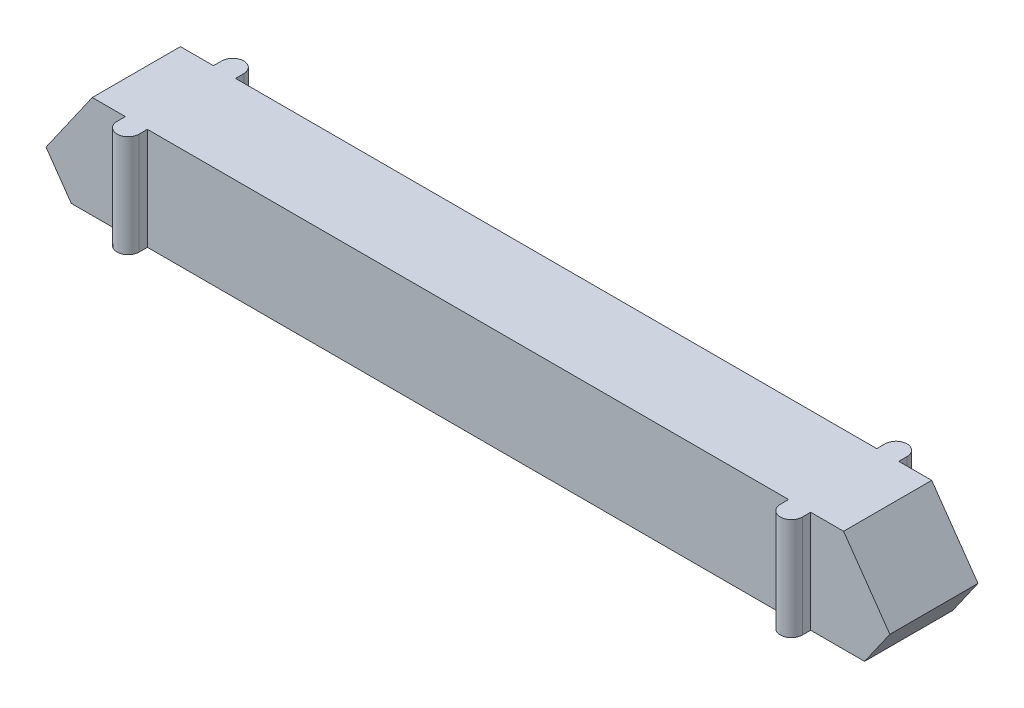
ISO-10303-21;
HEADER;
FILE_DESCRIPTION(('STEP AP214'),'2;1');
FILE_NAME('part.step','',(''),(''),'','','');
FILE_SCHEMA(('AUTOMOTIVE_DESIGN { 1 0 10303 214 1 1 1 1 }'));
ENDSEC;
DATA;
#1=APPLICATION_CONTEXT('core data for automotive mechanical design processes');
#2=APPLICATION_PROTOCOL_DEFINITION('international standard','automotive_design',2000,#1);
#3=PRODUCT_CONTEXT('',#1,'mechanical');
#4=PRODUCT('Part','Part','',(#3));
#5=PRODUCT_RELATED_PRODUCT_CATEGORY('part','',(#4));
#6=PRODUCT_DEFINITION_FORMATION('','',#4);
#7=PRODUCT_DEFINITION_CONTEXT('part definition',#1,'design');
#8=PRODUCT_DEFINITION('design','',#6,#7);
#9=PRODUCT_DEFINITION_SHAPE('','',#8);
#10=(LENGTH_UNIT() NAMED_UNIT(*) SI_UNIT(.MILLI.,.METRE.));
#11=(NAMED_UNIT(*) PLANE_ANGLE_UNIT() SI_UNIT($,.RADIAN.));
#12=(NAMED_UNIT(*) SI_UNIT($,.STERADIAN.) SOLID_ANGLE_UNIT());
#13=UNCERTAINTY_MEASURE_WITH_UNIT(LENGTH_MEASURE(1.E-05),#10,'distance_accuracy_value','');
#14=(GEOMETRIC_REPRESENTATION_CONTEXT(3) GLOBAL_UNCERTAINTY_ASSIGNED_CONTEXT((#13)) GLOBAL_UNIT_ASSIGNED_CONTEXT((#10,
#11,#12)) REPRESENTATION_CONTEXT('',''));
#15=CARTESIAN_POINT('',(0.,0.,0.));
#16=DIRECTION('',(0.,0.,1.));
#17=DIRECTION('',(1.,0.,0.));
#18=AXIS2_PLACEMENT_3D('',#15,#16,#17);
#19=CARTESIAN_POINT('',(0.,0.,0.));
#20=DIRECTION('',(0.,0.,1.));
#21=DIRECTION('',(1.,0.,0.));
#22=AXIS2_PLACEMENT_3D('',#19,#20,#21);
#23=PLANE('',#22);
#24=DIRECTION('',(1.,0.,0.));
#25=VECTOR('',#24,1.);
#26=CARTESIAN_POINT('',(14.5688414833165,-20.8064619249404,0.));
#27=LINE('',#26,#25);
#28=CARTESIAN_POINT('',(440.68209279421,-20.8064619249404,0.));
#29=VERTEX_POINT('',#28);
#30=CARTESIAN_POINT('',(471.768841483316,-20.8064619249404,0.));
#31=VERTEX_POINT('',#30);
#32=EDGE_CURVE('E320',#29,#31,#27,.T.);
#33=ORIENTED_EDGE('',*,*,#32,.F.);
#34=DIRECTION('',(0.,1.,0.));
#35=VECTOR('',#34,1.);
#36=CARTESIAN_POINT('',(440.68209279421,-37.6818184026567,0.));
#37=LINE('',#36,#35);
#38=CARTESIAN_POINT('',(440.68209279421,38.1,0.));
#39=VERTEX_POINT('',#38);
#40=EDGE_CURVE('E50',#29,#39,#37,.T.);
#41=ORIENTED_EDGE('',*,*,#40,.T.);
#42=DIRECTION('',(-1.,0.,0.));
#43=VECTOR('',#42,1.);
#44=CARTESIAN_POINT('',(459.659775760843,38.1,0.));
#45=LINE('',#44,#43);
#46=CARTESIAN_POINT('',(459.659775760843,38.1,0.));
#47=VERTEX_POINT('',#46);
#48=EDGE_CURVE('E301',#47,#39,#45,.T.);
#49=ORIENTED_EDGE('',*,*,#48,.F.);
#50=DIRECTION('',(-0.573576436351044,0.819152044288993,0.));
#51=VECTOR('',#50,1.);
#52=CARTESIAN_POINT('',(486.337682966633,0.,0.));
#53=LINE('',#52,#51);
#54=CARTESIAN_POINT('',(486.337682966633,0.,0.));
#55=VERTEX_POINT('',#54);
#56=EDGE_CURVE('E327',#55,#47,#53,.T.);
#57=ORIENTED_EDGE('',*,*,#56,.F.);
#58=DIRECTION('',(0.573576436351044,0.819152044288993,0.));
#59=VECTOR('',#58,1.);
#60=CARTESIAN_POINT('',(471.768841483316,-20.8064619249404,0.));
#61=LINE('',#60,#59);
#62=EDGE_CURVE('E324',#31,#55,#61,.T.);
#63=ORIENTED_EDGE('',*,*,#62,.F.);
#64=EDGE_LOOP('',(#33,#41,#49,#57,#63));
#65=FACE_BOUND('',#64,.T.);
#66=ADVANCED_FACE('F35',(#65),#23,.F.);
#67=CARTESIAN_POINT('',(0.,0.,50.8));
#68=DIRECTION('',(0.,0.,1.));
#69=DIRECTION('',(1.,0.,0.));
#70=AXIS2_PLACEMENT_3D('',#67,#68,#69);
#71=PLANE('',#70);
#72=DIRECTION('',(-1.,0.,0.));
#73=VECTOR('',#72,1.);
#74=CARTESIAN_POINT('',(459.659775760843,38.1,50.8));
#75=LINE('',#74,#73);
#76=CARTESIAN_POINT('',(459.659775760843,38.1,50.8));
#77=VERTEX_POINT('',#76);
#78=CARTESIAN_POINT('',(440.68209279421,38.1,50.8));
#79=VERTEX_POINT('',#78);
#80=EDGE_CURVE('E312',#77,#79,#75,.T.);
#81=ORIENTED_EDGE('',*,*,#80,.T.);
#82=DIRECTION('',(0.,1.,0.));
#83=VECTOR('',#82,1.);
#84=CARTESIAN_POINT('',(440.68209279421,-37.6818184026567,50.8));
#85=LINE('',#84,#83);
#86=CARTESIAN_POINT('',(440.68209279421,-20.8064619249404,50.8));
#87=VERTEX_POINT('',#86);
#88=EDGE_CURVE('E240',#87,#79,#85,.T.);
#89=ORIENTED_EDGE('',*,*,#88,.F.);
#90=DIRECTION('',(1.,0.,0.));
#91=VECTOR('',#90,1.);
#92=CARTESIAN_POINT('',(14.5688414833165,-20.8064619249404,50.8));
#93=LINE('',#92,#91);
#94=CARTESIAN_POINT('',(471.768841483316,-20.8064619249404,50.8));
#95=VERTEX_POINT('',#94);
#96=EDGE_CURVE('E303',#87,#95,#93,.T.);
#97=ORIENTED_EDGE('',*,*,#96,.T.);
#98=DIRECTION('',(0.573576436351044,0.819152044288993,0.));
#99=VECTOR('',#98,1.);
#100=CARTESIAN_POINT('',(471.768841483316,-20.8064619249404,50.8));
#101=LINE('',#100,#99);
#102=CARTESIAN_POINT('',(486.337682966633,0.,50.8));
#103=VERTEX_POINT('',#102);
#104=EDGE_CURVE('E306',#95,#103,#101,.T.);
#105=ORIENTED_EDGE('',*,*,#104,.T.);
#106=DIRECTION('',(-0.573576436351044,0.819152044288993,0.));
#107=VECTOR('',#106,1.);
#108=CARTESIAN_POINT('',(486.337682966633,0.,50.8));
#109=LINE('',#108,#107);
#110=EDGE_CURVE('E309',#103,#77,#109,.T.);
#111=ORIENTED_EDGE('',*,*,#110,.T.);
#112=EDGE_LOOP('',(#81,#89,#97,#105,#111));
#113=FACE_BOUND('',#112,.T.);
#114=ADVANCED_FACE('F390',(#113),#71,.T.);
#115=CARTESIAN_POINT('',(58.4279072057898,-20.8064619249404,50.8));
#116=VERTEX_POINT('',#115);
#117=CARTESIAN_POINT('',(427.98209279421,-20.8064619249404,50.8));
#118=VERTEX_POINT('',#117);
#119=EDGE_CURVE('E307',#116,#118,#93,.T.);
#120=ORIENTED_EDGE('',*,*,#119,.T.);
#121=DIRECTION('',(0.,1.,0.));
#122=VECTOR('',#121,1.);
#123=CARTESIAN_POINT('',(427.98209279421,-37.6818184026567,50.8));
#124=LINE('',#123,#122);
#125=CARTESIAN_POINT('',(427.98209279421,38.1,50.8));
#126=VERTEX_POINT('',#125);
#127=EDGE_CURVE('E58',#118,#126,#124,.T.);
#128=ORIENTED_EDGE('',*,*,#127,.T.);
#129=CARTESIAN_POINT('',(58.4279072057898,38.1,50.8));
#130=VERTEX_POINT('',#129);
#131=EDGE_CURVE('E315',#126,#130,#75,.T.);
#132=ORIENTED_EDGE('',*,*,#131,.T.);
#133=DIRECTION('',(0.,1.,0.));
#134=VECTOR('',#133,1.);
#135=CARTESIAN_POINT('',(58.4279072057898,-37.6818184026567,50.8));
#136=LINE('',#135,#134);
#137=EDGE_CURVE('E291',#116,#130,#136,.T.);
#138=ORIENTED_EDGE('',*,*,#137,.F.);
#139=EDGE_LOOP('',(#120,#128,#132,#138));
#140=FACE_BOUND('',#139,.T.);
#141=ADVANCED_FACE('F421',(#140),#71,.T.);
#142=DIRECTION('',(0.,1.,0.));
#143=VECTOR('',#142,1.);
#144=CARTESIAN_POINT('',(45.7279072057897,-37.6818184026567,0.));
#145=LINE('',#144,#143);
#146=CARTESIAN_POINT('',(45.7279072057897,-20.8064619249404,0.));
#147=VERTEX_POINT('',#146);
#148=CARTESIAN_POINT('',(45.7279072057897,38.1,0.));
#149=VERTEX_POINT('',#148);
#150=EDGE_CURVE('E268',#147,#149,#145,.T.);
#151=ORIENTED_EDGE('',*,*,#150,.F.);
#152=CARTESIAN_POINT('',(14.5688414833165,-20.8064619249404,0.));
#153=VERTEX_POINT('',#152);
#154=EDGE_CURVE('E321',#153,#147,#27,.T.);
#155=ORIENTED_EDGE('',*,*,#154,.F.);
#156=DIRECTION('',(0.573576436351045,-0.819152044288993,0.));
#157=VECTOR('',#156,1.);
#158=CARTESIAN_POINT('',(0.,0.,0.));
#159=LINE('',#158,#157);
#160=CARTESIAN_POINT('',(0.,0.,0.));
#161=VERTEX_POINT('',#160);
#162=EDGE_CURVE('E318',#161,#153,#159,.T.);
#163=ORIENTED_EDGE('',*,*,#162,.F.);
#164=DIRECTION('',(-0.573576436351044,-0.819152044288993,0.));
#165=VECTOR('',#164,1.);
#166=CARTESIAN_POINT('',(26.6779072057897,38.0999999999999,0.));
#167=LINE('',#166,#165);
#168=CARTESIAN_POINT('',(26.6779072057897,38.0999999999999,0.));
#169=VERTEX_POINT('',#168);
#170=EDGE_CURVE('E296',#169,#161,#167,.T.);
#171=ORIENTED_EDGE('',*,*,#170,.F.);
#172=EDGE_CURVE('E329',#149,#169,#45,.T.);
#173=ORIENTED_EDGE('',*,*,#172,.F.);
#174=EDGE_LOOP('',(#151,#155,#163,#171,#173));
#175=FACE_BOUND('',#174,.T.);
#176=ADVANCED_FACE('F351',(#175),#23,.F.);
#177=CARTESIAN_POINT('',(14.5688414833165,-20.8064619249404,50.8));
#178=VERTEX_POINT('',#177);
#179=CARTESIAN_POINT('',(45.7279072057897,-20.8064619249404,50.8));
#180=VERTEX_POINT('',#179);
#181=EDGE_CURVE('E304',#178,#180,#93,.T.);
#182=ORIENTED_EDGE('',*,*,#181,.T.);
#183=DIRECTION('',(0.,1.,0.));
#184=VECTOR('',#183,1.);
#185=CARTESIAN_POINT('',(45.7279072057897,-37.6818184026567,50.8));
#186=LINE('',#185,#184);
#187=CARTESIAN_POINT('',(45.7279072057897,38.0999999999999,50.8));
#188=VERTEX_POINT('',#187);
#189=EDGE_CURVE('E289',#180,#188,#186,.T.);
#190=ORIENTED_EDGE('',*,*,#189,.T.);
#191=CARTESIAN_POINT('',(26.6779072057897,38.0999999999999,50.8));
#192=VERTEX_POINT('',#191);
#193=EDGE_CURVE('E311',#188,#192,#75,.T.);
#194=ORIENTED_EDGE('',*,*,#193,.T.);
#195=DIRECTION('',(-0.573576436351044,-0.819152044288993,0.));
#196=VECTOR('',#195,1.);
#197=CARTESIAN_POINT('',(26.6779072057897,38.0999999999999,50.8));
#198=LINE('',#197,#196);
#199=CARTESIAN_POINT('',(0.,0.,50.8));
#200=VERTEX_POINT('',#199);
#201=EDGE_CURVE('E297',#192,#200,#198,.T.);
#202=ORIENTED_EDGE('',*,*,#201,.T.);
#203=DIRECTION('',(0.573576436351045,-0.819152044288993,0.));
#204=VECTOR('',#203,1.);
#205=CARTESIAN_POINT('',(0.,0.,50.8));
#206=LINE('',#205,#204);
#207=EDGE_CURVE('E300',#200,#178,#206,.T.);
#208=ORIENTED_EDGE('',*,*,#207,.T.);
#209=EDGE_LOOP('',(#182,#190,#194,#202,#208));
#210=FACE_BOUND('',#209,.T.);
#211=ADVANCED_FACE('F419',(#210),#71,.T.);
#212=CARTESIAN_POINT('',(26.6779072057897,38.0999999999999,50.8));
#213=DIRECTION('',(0.819152044288993,-0.573576436351044,0.));
#214=DIRECTION('',(0.573576436351044,0.819152044288994,0.));
#215=AXIS2_PLACEMENT_3D('',#212,#213,#214);
#216=PLANE('',#215);
#217=ORIENTED_EDGE('',*,*,#170,.T.);
#218=DIRECTION('',(0.,0.,-1.));
#219=VECTOR('',#218,1.);
#220=CARTESIAN_POINT('',(0.,0.,50.8));
#221=LINE('',#220,#219);
#222=EDGE_CURVE('E11',#200,#161,#221,.T.);
#223=ORIENTED_EDGE('',*,*,#222,.F.);
#224=ORIENTED_EDGE('',*,*,#201,.F.);
#225=DIRECTION('',(0.,0.,-1.));
#226=VECTOR('',#225,1.);
#227=CARTESIAN_POINT('',(26.6779072057897,38.0999999999999,50.8));
#228=LINE('',#227,#226);
#229=EDGE_CURVE('E314',#192,#169,#228,.T.);
#230=ORIENTED_EDGE('',*,*,#229,.T.);
#231=EDGE_LOOP('',(#217,#223,#224,#230));
#232=FACE_BOUND('',#231,.T.);
#233=ADVANCED_FACE('F37',(#232),#216,.F.);
#234=CARTESIAN_POINT('',(0.,0.,50.8));
#235=DIRECTION('',(0.819152044288993,0.573576436351045,0.));
#236=DIRECTION('',(-0.573576436351045,0.819152044288993,0.));
#237=AXIS2_PLACEMENT_3D('',#234,#235,#236);
#238=PLANE('',#237);
#239=ORIENTED_EDGE('',*,*,#162,.T.);
#240=DIRECTION('',(0.,0.,-1.));
#241=VECTOR('',#240,1.);
#242=CARTESIAN_POINT('',(14.5688414833165,-20.8064619249404,50.8));
#243=LINE('',#242,#241);
#244=EDGE_CURVE('E43',#178,#153,#243,.T.);
#245=ORIENTED_EDGE('',*,*,#244,.F.);
#246=ORIENTED_EDGE('',*,*,#207,.F.);
#247=ORIENTED_EDGE('',*,*,#222,.T.);
#248=EDGE_LOOP('',(#239,#245,#246,#247));
#249=FACE_BOUND('',#248,.T.);
#250=ADVANCED_FACE('F448',(#249),#238,.F.);
#251=CARTESIAN_POINT('',(14.5688414833165,-20.8064619249404,50.8));
#252=DIRECTION('',(0.,1.,0.));
#253=DIRECTION('',(-1.,0.,0.));
#254=AXIS2_PLACEMENT_3D('',#251,#252,#253);
#255=PLANE('',#254);
#256=ORIENTED_EDGE('',*,*,#154,.T.);
#257=DIRECTION('',(0.,0.,1.));
#258=VECTOR('',#257,1.);
#259=CARTESIAN_POINT('',(45.7279072057897,-20.8064619249404,-4.7625));
#260=LINE('',#259,#258);
#261=CARTESIAN_POINT('',(45.7279072057897,-20.8064619249404,-4.7625));
#262=VERTEX_POINT('',#261);
#263=EDGE_CURVE('E250',#262,#147,#260,.T.);
#264=ORIENTED_EDGE('',*,*,#263,.F.);
#265=CARTESIAN_POINT('',(52.0779072057898,-20.8064619249404,-4.7625));
#266=DIRECTION('',(0.,1.,0.));
#267=DIRECTION('',(-1.,0.,0.));
#268=AXIS2_PLACEMENT_3D('',#265,#266,#267);
#269=CIRCLE('',#268,6.35);
#270=CARTESIAN_POINT('',(58.4279072057898,-20.8064619249404,-4.7625));
#271=VERTEX_POINT('',#270);
#272=EDGE_CURVE('E249',#271,#262,#269,.T.);
#273=ORIENTED_EDGE('',*,*,#272,.F.);
#274=DIRECTION('',(0.,0.,-1.));
#275=VECTOR('',#274,1.);
#276=CARTESIAN_POINT('',(58.4279072057898,-20.8064619249404,-4.7625));
#277=LINE('',#276,#275);
#278=CARTESIAN_POINT('',(58.4279072057898,-20.8064619249404,0.));
#279=VERTEX_POINT('',#278);
#280=EDGE_CURVE('E246',#279,#271,#277,.T.);
#281=ORIENTED_EDGE('',*,*,#280,.F.);
#282=CARTESIAN_POINT('',(427.98209279421,-20.8064619249404,0.));
#283=VERTEX_POINT('',#282);
#284=EDGE_CURVE('E325',#279,#283,#27,.T.);
#285=ORIENTED_EDGE('',*,*,#284,.T.);
#286=DIRECTION('',(0.,0.,-1.));
#287=VECTOR('',#286,1.);
#288=CARTESIAN_POINT('',(427.98209279421,-20.8064619249404,-4.7625));
#289=LINE('',#288,#287);
#290=CARTESIAN_POINT('',(427.98209279421,-20.8064619249404,-4.7625));
#291=VERTEX_POINT('',#290);
#292=EDGE_CURVE('E217',#283,#291,#289,.T.);
#293=ORIENTED_EDGE('',*,*,#292,.T.);
#294=CARTESIAN_POINT('',(434.33209279421,-20.8064619249404,-4.7625));
#295=DIRECTION('',(0.,1.,0.));
#296=DIRECTION('',(-1.,0.,0.));
#297=AXIS2_PLACEMENT_3D('',#294,#295,#296);
#298=CIRCLE('',#297,6.35);
#299=CARTESIAN_POINT('',(440.68209279421,-20.8064619249404,-4.7625));
#300=VERTEX_POINT('',#299);
#301=EDGE_CURVE('E193',#291,#300,#298,.F.);
#302=ORIENTED_EDGE('',*,*,#301,.T.);
#303=DIRECTION('',(0.,0.,1.));
#304=VECTOR('',#303,1.);
#305=CARTESIAN_POINT('',(440.68209279421,-20.8064619249404,-4.7625));
#306=LINE('',#305,#304);
#307=EDGE_CURVE('E214',#300,#29,#306,.T.);
#308=ORIENTED_EDGE('',*,*,#307,.T.);
#309=ORIENTED_EDGE('',*,*,#32,.T.);
#310=DIRECTION('',(0.,0.,-1.));
#311=VECTOR('',#310,1.);
#312=CARTESIAN_POINT('',(471.768841483316,-20.8064619249404,50.8));
#313=LINE('',#312,#311);
#314=EDGE_CURVE('E340',#95,#31,#313,.T.);
#315=ORIENTED_EDGE('',*,*,#314,.F.);
#316=ORIENTED_EDGE('',*,*,#96,.F.);
#317=DIRECTION('',(0.,0.,-1.));
#318=VECTOR('',#317,1.);
#319=CARTESIAN_POINT('',(440.68209279421,-20.8064619249404,55.5625));
#320=LINE('',#319,#318);
#321=CARTESIAN_POINT('',(440.68209279421,-20.8064619249404,55.5625));
#322=VERTEX_POINT('',#321);
#323=EDGE_CURVE('E224',#322,#87,#320,.T.);
#324=ORIENTED_EDGE('',*,*,#323,.F.);
#325=CARTESIAN_POINT('',(434.33209279421,-20.8064619249404,55.5625));
#326=DIRECTION('',(0.,1.,0.));
#327=DIRECTION('',(-1.,0.,0.));
#328=AXIS2_PLACEMENT_3D('',#325,#326,#327);
#329=CIRCLE('',#328,6.35);
#330=CARTESIAN_POINT('',(427.98209279421,-20.8064619249404,55.5625));
#331=VERTEX_POINT('',#330);
#332=EDGE_CURVE('E223',#331,#322,#329,.T.);
#333=ORIENTED_EDGE('',*,*,#332,.F.);
#334=DIRECTION('',(0.,0.,1.));
#335=VECTOR('',#334,1.);
#336=CARTESIAN_POINT('',(427.98209279421,-20.8064619249404,55.5625));
#337=LINE('',#336,#335);
#338=EDGE_CURVE('E220',#118,#331,#337,.T.);
#339=ORIENTED_EDGE('',*,*,#338,.F.);
#340=ORIENTED_EDGE('',*,*,#119,.F.);
#341=DIRECTION('',(0.,0.,1.));
#342=VECTOR('',#341,1.);
#343=CARTESIAN_POINT('',(58.4279072057898,-20.8064619249404,55.5625));
#344=LINE('',#343,#342);
#345=CARTESIAN_POINT('',(58.4279072057898,-20.8064619249404,55.5625));
#346=VERTEX_POINT('',#345);
#347=EDGE_CURVE('E278',#116,#346,#344,.T.);
#348=ORIENTED_EDGE('',*,*,#347,.T.);
#349=CARTESIAN_POINT('',(52.0779072057898,-20.8064619249404,55.5625));
#350=DIRECTION('',(0.,1.,0.));
#351=DIRECTION('',(-1.,0.,0.));
#352=AXIS2_PLACEMENT_3D('',#349,#350,#351);
#353=CIRCLE('',#352,6.35);
#354=CARTESIAN_POINT('',(45.7279072057897,-20.8064619249404,55.5625));
#355=VERTEX_POINT('',#354);
#356=EDGE_CURVE('E275',#346,#355,#353,.F.);
#357=ORIENTED_EDGE('',*,*,#356,.T.);
#358=DIRECTION('',(0.,0.,-1.));
#359=VECTOR('',#358,1.);
#360=CARTESIAN_POINT('',(45.7279072057897,-20.8064619249404,55.5625));
#361=LINE('',#360,#359);
#362=EDGE_CURVE('E272',#355,#180,#361,.T.);
#363=ORIENTED_EDGE('',*,*,#362,.T.);
#364=ORIENTED_EDGE('',*,*,#181,.F.);
#365=ORIENTED_EDGE('',*,*,#244,.T.);
#366=EDGE_LOOP('',(#256,#264,#273,#281,#285,#293,#302,#308,#309,#315,#316,#324,#333,#339,#340,
#348,#357,#363,#364,#365));
#367=FACE_BOUND('',#366,.T.);
#368=ADVANCED_FACE('F347',(#367),#255,.F.);
#369=CARTESIAN_POINT('',(471.768841483316,-20.8064619249404,50.8));
#370=DIRECTION('',(-0.819152044288993,0.573576436351044,0.));
#371=DIRECTION('',(-0.573576436351044,-0.819152044288994,0.));
#372=AXIS2_PLACEMENT_3D('',#369,#370,#371);
#373=PLANE('',#372);
#374=ORIENTED_EDGE('',*,*,#62,.T.);
#375=DIRECTION('',(0.,0.,-1.));
#376=VECTOR('',#375,1.);
#377=CARTESIAN_POINT('',(486.337682966633,0.,50.8));
#378=LINE('',#377,#376);
#379=EDGE_CURVE('E337',#103,#55,#378,.T.);
#380=ORIENTED_EDGE('',*,*,#379,.F.);
#381=ORIENTED_EDGE('',*,*,#104,.F.);
#382=ORIENTED_EDGE('',*,*,#314,.T.);
#383=EDGE_LOOP('',(#374,#380,#381,#382));
#384=FACE_BOUND('',#383,.T.);
#385=ADVANCED_FACE('F377',(#384),#373,.F.);
#386=CARTESIAN_POINT('',(486.337682966633,0.,50.8));
#387=DIRECTION('',(-0.819152044288994,-0.573576436351044,0.));
#388=DIRECTION('',(0.573576436351044,-0.819152044288994,0.));
#389=AXIS2_PLACEMENT_3D('',#386,#387,#388);
#390=PLANE('',#389);
#391=ORIENTED_EDGE('',*,*,#56,.T.);
#392=DIRECTION('',(0.,0.,-1.));
#393=VECTOR('',#392,1.);
#394=CARTESIAN_POINT('',(459.659775760843,38.1,50.8));
#395=LINE('',#394,#393);
#396=EDGE_CURVE('E334',#77,#47,#395,.T.);
#397=ORIENTED_EDGE('',*,*,#396,.F.);
#398=ORIENTED_EDGE('',*,*,#110,.F.);
#399=ORIENTED_EDGE('',*,*,#379,.T.);
#400=EDGE_LOOP('',(#391,#397,#398,#399));
#401=FACE_BOUND('',#400,.T.);
#402=ADVANCED_FACE('F383',(#401),#390,.F.);
#403=CARTESIAN_POINT('',(459.659775760843,38.1,50.8));
#404=DIRECTION('',(0.,-1.,0.));
#405=DIRECTION('',(1.,0.,0.));
#406=AXIS2_PLACEMENT_3D('',#403,#404,#405);
#407=PLANE('',#406);
#408=ORIENTED_EDGE('',*,*,#48,.T.);
#409=DIRECTION('',(0.,0.,-1.));
#410=VECTOR('',#409,1.);
#411=CARTESIAN_POINT('',(440.68209279421,38.1,-4.7625));
#412=LINE('',#411,#410);
#413=CARTESIAN_POINT('',(440.68209279421,38.1,-4.7625));
#414=VERTEX_POINT('',#413);
#415=EDGE_CURVE('E196',#39,#414,#412,.T.);
#416=ORIENTED_EDGE('',*,*,#415,.T.);
#417=CARTESIAN_POINT('',(434.33209279421,38.1,-4.7625));
#418=DIRECTION('',(0.,1.,0.));
#419=DIRECTION('',(1.,0.,0.));
#420=AXIS2_PLACEMENT_3D('',#417,#418,#419);
#421=CIRCLE('',#420,6.35);
#422=CARTESIAN_POINT('',(427.98209279421,38.1,-4.7625));
#423=VERTEX_POINT('',#422);
#424=EDGE_CURVE('E191',#414,#423,#421,.T.);
#425=ORIENTED_EDGE('',*,*,#424,.T.);
#426=DIRECTION('',(0.,0.,1.));
#427=VECTOR('',#426,1.);
#428=CARTESIAN_POINT('',(427.98209279421,38.1,-4.7625));
#429=LINE('',#428,#427);
#430=CARTESIAN_POINT('',(427.98209279421,38.1,0.));
#431=VERTEX_POINT('',#430);
#432=EDGE_CURVE('E199',#423,#431,#429,.T.);
#433=ORIENTED_EDGE('',*,*,#432,.T.);
#434=CARTESIAN_POINT('',(58.4279072057898,38.1,0.));
#435=VERTEX_POINT('',#434);
#436=EDGE_CURVE('E331',#431,#435,#45,.T.);
#437=ORIENTED_EDGE('',*,*,#436,.T.);
#438=DIRECTION('',(0.,0.,1.));
#439=VECTOR('',#438,1.);
#440=CARTESIAN_POINT('',(58.4279072057898,38.1,-4.7625));
#441=LINE('',#440,#439);
#442=CARTESIAN_POINT('',(58.4279072057898,38.1,-4.7625));
#443=VERTEX_POINT('',#442);
#444=EDGE_CURVE('E259',#443,#435,#441,.T.);
#445=ORIENTED_EDGE('',*,*,#444,.F.);
#446=CARTESIAN_POINT('',(52.0779072057897,38.1,-4.7625));
#447=DIRECTION('',(0.,-1.,0.));
#448=DIRECTION('',(-1.,0.,0.));
#449=AXIS2_PLACEMENT_3D('',#446,#447,#448);
#450=CIRCLE('',#449,6.35);
#451=CARTESIAN_POINT('',(45.7279072057897,38.1,-4.7625));
#452=VERTEX_POINT('',#451);
#453=EDGE_CURVE('E227',#452,#443,#450,.T.);
#454=ORIENTED_EDGE('',*,*,#453,.F.);
#455=DIRECTION('',(0.,0.,-1.));
#456=VECTOR('',#455,1.);
#457=CARTESIAN_POINT('',(45.7279072057897,38.1,-4.7625));
#458=LINE('',#457,#456);
#459=EDGE_CURVE('E256',#149,#452,#458,.T.);
#460=ORIENTED_EDGE('',*,*,#459,.F.);
#461=ORIENTED_EDGE('',*,*,#172,.T.);
#462=ORIENTED_EDGE('',*,*,#229,.F.);
#463=ORIENTED_EDGE('',*,*,#193,.F.);
#464=DIRECTION('',(0.,0.,1.));
#465=VECTOR('',#464,1.);
#466=CARTESIAN_POINT('',(45.7279072057897,38.1,55.5625));
#467=LINE('',#466,#465);
#468=CARTESIAN_POINT('',(45.7279072057897,38.1,55.5625));
#469=VERTEX_POINT('',#468);
#470=EDGE_CURVE('E284',#188,#469,#467,.T.);
#471=ORIENTED_EDGE('',*,*,#470,.T.);
#472=CARTESIAN_POINT('',(52.0779072057897,38.1,55.5625));
#473=DIRECTION('',(0.,1.,0.));
#474=DIRECTION('',(-1.,0.,0.));
#475=AXIS2_PLACEMENT_3D('',#472,#473,#474);
#476=CIRCLE('',#475,6.35);
#477=CARTESIAN_POINT('',(58.4279072057898,38.1,55.5625));
#478=VERTEX_POINT('',#477);
#479=EDGE_CURVE('E253',#469,#478,#476,.T.);
#480=ORIENTED_EDGE('',*,*,#479,.T.);
#481=DIRECTION('',(0.,0.,-1.));
#482=VECTOR('',#481,1.);
#483=CARTESIAN_POINT('',(58.4279072057898,38.1,55.5625));
#484=LINE('',#483,#482);
#485=EDGE_CURVE('E281',#478,#130,#484,.T.);
#486=ORIENTED_EDGE('',*,*,#485,.T.);
#487=ORIENTED_EDGE('',*,*,#131,.F.);
#488=DIRECTION('',(0.,0.,-1.));
#489=VECTOR('',#488,1.);
#490=CARTESIAN_POINT('',(427.98209279421,38.1,55.5625));
#491=LINE('',#490,#489);
#492=CARTESIAN_POINT('',(427.98209279421,38.1,55.5625));
#493=VERTEX_POINT('',#492);
#494=EDGE_CURVE('E233',#493,#126,#491,.T.);
#495=ORIENTED_EDGE('',*,*,#494,.F.);
#496=CARTESIAN_POINT('',(434.33209279421,38.1,55.5625));
#497=DIRECTION('',(0.,-1.,0.));
#498=DIRECTION('',(1.,0.,0.));
#499=AXIS2_PLACEMENT_3D('',#496,#497,#498);
#500=CIRCLE('',#499,6.35);
#501=CARTESIAN_POINT('',(440.68209279421,38.1,55.5625));
#502=VERTEX_POINT('',#501);
#503=EDGE_CURVE('E219',#502,#493,#500,.T.);
#504=ORIENTED_EDGE('',*,*,#503,.F.);
#505=DIRECTION('',(0.,0.,1.));
#506=VECTOR('',#505,1.);
#507=CARTESIAN_POINT('',(440.68209279421,38.1,55.5625));
#508=LINE('',#507,#506);
#509=EDGE_CURVE('E230',#79,#502,#508,.T.);
#510=ORIENTED_EDGE('',*,*,#509,.F.);
#511=ORIENTED_EDGE('',*,*,#80,.F.);
#512=ORIENTED_EDGE('',*,*,#396,.T.);
#513=EDGE_LOOP('',(#408,#416,#425,#433,#437,#445,#454,#460,#461,#462,#463,#471,#480,#486,#487,
#495,#504,#510,#511,#512));
#514=FACE_BOUND('',#513,.T.);
#515=ADVANCED_FACE('F206',(#514),#407,.F.);
#516=ORIENTED_EDGE('',*,*,#436,.F.);
#517=DIRECTION('',(0.,1.,0.));
#518=VECTOR('',#517,1.);
#519=CARTESIAN_POINT('',(427.98209279421,-37.6818184026567,0.));
#520=LINE('',#519,#518);
#521=EDGE_CURVE('E195',#283,#431,#520,.T.);
#522=ORIENTED_EDGE('',*,*,#521,.F.);
#523=ORIENTED_EDGE('',*,*,#284,.F.);
#524=DIRECTION('',(0.,1.,0.));
#525=VECTOR('',#524,1.);
#526=CARTESIAN_POINT('',(58.4279072057898,-37.6818184026567,0.));
#527=LINE('',#526,#525);
#528=EDGE_CURVE('E265',#279,#435,#527,.T.);
#529=ORIENTED_EDGE('',*,*,#528,.T.);
#530=EDGE_LOOP('',(#516,#522,#523,#529));
#531=FACE_BOUND('',#530,.T.);
#532=ADVANCED_FACE('F370',(#531),#23,.F.);
#533=CARTESIAN_POINT('',(52.0779072057898,-37.6818184026567,55.5625));
#534=DIRECTION('',(0.,1.,0.));
#535=DIRECTION('',(-1.,0.,0.));
#536=AXIS2_PLACEMENT_3D('',#533,#534,#535);
#537=CYLINDRICAL_SURFACE('',#536,6.35);
#538=ORIENTED_EDGE('',*,*,#356,.F.);
#539=DIRECTION('',(0.,1.,0.));
#540=VECTOR('',#539,1.);
#541=CARTESIAN_POINT('',(58.4279072057898,-37.6818184026567,55.5625));
#542=LINE('',#541,#540);
#543=EDGE_CURVE('E287',#346,#478,#542,.T.);
#544=ORIENTED_EDGE('',*,*,#543,.T.);
#545=ORIENTED_EDGE('',*,*,#479,.F.);
#546=DIRECTION('',(0.,1.,0.));
#547=VECTOR('',#546,1.);
#548=CARTESIAN_POINT('',(45.7279072057897,-37.6818184026567,55.5625));
#549=LINE('',#548,#547);
#550=EDGE_CURVE('E276',#355,#469,#549,.T.);
#551=ORIENTED_EDGE('',*,*,#550,.F.);
#552=EDGE_LOOP('',(#538,#544,#545,#551));
#553=FACE_BOUND('',#552,.T.);
#554=ADVANCED_FACE('F410',(#553),#537,.T.);
#555=CARTESIAN_POINT('',(45.7279072057897,-37.6818184026567,55.5625));
#556=DIRECTION('',(-1.,0.,0.));
#557=DIRECTION('',(0.,0.,1.));
#558=AXIS2_PLACEMENT_3D('',#555,#556,#557);
#559=PLANE('',#558);
#560=ORIENTED_EDGE('',*,*,#362,.F.);
#561=ORIENTED_EDGE('',*,*,#550,.T.);
#562=ORIENTED_EDGE('',*,*,#470,.F.);
#563=ORIENTED_EDGE('',*,*,#189,.F.);
#564=EDGE_LOOP('',(#560,#561,#562,#563));
#565=FACE_BOUND('',#564,.T.);
#566=ADVANCED_FACE('F415',(#565),#559,.T.);
#567=CARTESIAN_POINT('',(58.4279072057898,-37.6818184026567,55.5625));
#568=DIRECTION('',(1.,0.,0.));
#569=DIRECTION('',(0.,0.,-1.));
#570=AXIS2_PLACEMENT_3D('',#567,#568,#569);
#571=PLANE('',#570);
#572=ORIENTED_EDGE('',*,*,#347,.F.);
#573=ORIENTED_EDGE('',*,*,#137,.T.);
#574=ORIENTED_EDGE('',*,*,#485,.F.);
#575=ORIENTED_EDGE('',*,*,#543,.F.);
#576=EDGE_LOOP('',(#572,#573,#574,#575));
#577=FACE_BOUND('',#576,.T.);
#578=ADVANCED_FACE('F406',(#577),#571,.T.);
#579=CARTESIAN_POINT('',(45.7279072057897,-37.6818184026567,-4.7625));
#580=DIRECTION('',(1.,0.,0.));
#581=DIRECTION('',(0.,0.,-1.));
#582=AXIS2_PLACEMENT_3D('',#579,#580,#581);
#583=PLANE('',#582);
#584=DIRECTION('',(0.,1.,0.));
#585=VECTOR('',#584,1.);
#586=CARTESIAN_POINT('',(45.7279072057897,-37.6818184026567,-4.7625));
#587=LINE('',#586,#585);
#588=EDGE_CURVE('E262',#262,#452,#587,.T.);
#589=ORIENTED_EDGE('',*,*,#588,.F.);
#590=ORIENTED_EDGE('',*,*,#263,.T.);
#591=ORIENTED_EDGE('',*,*,#150,.T.);
#592=ORIENTED_EDGE('',*,*,#459,.T.);
#593=EDGE_LOOP('',(#589,#590,#591,#592));
#594=FACE_BOUND('',#593,.T.);
#595=ADVANCED_FACE('F357',(#594),#583,.F.);
#596=CARTESIAN_POINT('',(58.4279072057898,-37.6818184026567,-4.7625));
#597=DIRECTION('',(-1.,0.,0.));
#598=DIRECTION('',(0.,0.,1.));
#599=AXIS2_PLACEMENT_3D('',#596,#597,#598);
#600=PLANE('',#599);
#601=ORIENTED_EDGE('',*,*,#528,.F.);
#602=ORIENTED_EDGE('',*,*,#280,.T.);
#603=DIRECTION('',(0.,1.,0.));
#604=VECTOR('',#603,1.);
#605=CARTESIAN_POINT('',(58.4279072057898,-37.6818184026567,-4.7625));
#606=LINE('',#605,#604);
#607=EDGE_CURVE('E263',#271,#443,#606,.T.);
#608=ORIENTED_EDGE('',*,*,#607,.T.);
#609=ORIENTED_EDGE('',*,*,#444,.T.);
#610=EDGE_LOOP('',(#601,#602,#608,#609));
#611=FACE_BOUND('',#610,.T.);
#612=ADVANCED_FACE('F368',(#611),#600,.F.);
#613=CARTESIAN_POINT('',(52.0779072057898,-37.6818184026567,-4.7625));
#614=DIRECTION('',(0.,1.,0.));
#615=DIRECTION('',(-1.,0.,0.));
#616=AXIS2_PLACEMENT_3D('',#613,#614,#615);
#617=CYLINDRICAL_SURFACE('',#616,6.35);
#618=ORIENTED_EDGE('',*,*,#607,.F.);
#619=ORIENTED_EDGE('',*,*,#272,.T.);
#620=ORIENTED_EDGE('',*,*,#588,.T.);
#621=ORIENTED_EDGE('',*,*,#453,.T.);
#622=EDGE_LOOP('',(#618,#619,#620,#621));
#623=FACE_BOUND('',#622,.T.);
#624=ADVANCED_FACE('F363',(#623),#617,.T.);
#625=CARTESIAN_POINT('',(440.68209279421,-37.6818184026567,55.5625));
#626=DIRECTION('',(-1.,0.,0.));
#627=DIRECTION('',(0.,0.,1.));
#628=AXIS2_PLACEMENT_3D('',#625,#626,#627);
#629=PLANE('',#628);
#630=DIRECTION('',(0.,1.,0.));
#631=VECTOR('',#630,1.);
#632=CARTESIAN_POINT('',(440.68209279421,-37.6818184026567,55.5625));
#633=LINE('',#632,#631);
#634=EDGE_CURVE('E236',#322,#502,#633,.T.);
#635=ORIENTED_EDGE('',*,*,#634,.F.);
#636=ORIENTED_EDGE('',*,*,#323,.T.);
#637=ORIENTED_EDGE('',*,*,#88,.T.);
#638=ORIENTED_EDGE('',*,*,#509,.T.);
#639=EDGE_LOOP('',(#635,#636,#637,#638));
#640=FACE_BOUND('',#639,.T.);
#641=ADVANCED_FACE('F393',(#640),#629,.F.);
#642=CARTESIAN_POINT('',(427.98209279421,-37.6818184026567,55.5625));
#643=DIRECTION('',(1.,0.,0.));
#644=DIRECTION('',(0.,0.,-1.));
#645=AXIS2_PLACEMENT_3D('',#642,#643,#644);
#646=PLANE('',#645);
#647=ORIENTED_EDGE('',*,*,#127,.F.);
#648=ORIENTED_EDGE('',*,*,#338,.T.);
#649=DIRECTION('',(0.,1.,0.));
#650=VECTOR('',#649,1.);
#651=CARTESIAN_POINT('',(427.98209279421,-37.6818184026567,55.5625));
#652=LINE('',#651,#650);
#653=EDGE_CURVE('E237',#331,#493,#652,.T.);
#654=ORIENTED_EDGE('',*,*,#653,.T.);
#655=ORIENTED_EDGE('',*,*,#494,.T.);
#656=EDGE_LOOP('',(#647,#648,#654,#655));
#657=FACE_BOUND('',#656,.T.);
#658=ADVANCED_FACE('F400',(#657),#646,.F.);
#659=CARTESIAN_POINT('',(434.33209279421,-37.6818184026567,55.5625));
#660=DIRECTION('',(0.,1.,0.));
#661=DIRECTION('',(-1.,0.,0.));
#662=AXIS2_PLACEMENT_3D('',#659,#660,#661);
#663=CYLINDRICAL_SURFACE('',#662,6.35);
#664=ORIENTED_EDGE('',*,*,#653,.F.);
#665=ORIENTED_EDGE('',*,*,#332,.T.);
#666=ORIENTED_EDGE('',*,*,#634,.T.);
#667=ORIENTED_EDGE('',*,*,#503,.T.);
#668=EDGE_LOOP('',(#664,#665,#666,#667));
#669=FACE_BOUND('',#668,.T.);
#670=ADVANCED_FACE('F397',(#669),#663,.T.);
#671=CARTESIAN_POINT('',(434.33209279421,-37.6818184026567,-4.7625));
#672=DIRECTION('',(0.,1.,0.));
#673=DIRECTION('',(-1.,0.,0.));
#674=AXIS2_PLACEMENT_3D('',#671,#672,#673);
#675=CYLINDRICAL_SURFACE('',#674,6.35);
#676=ORIENTED_EDGE('',*,*,#301,.F.);
#677=DIRECTION('',(0.,1.,0.));
#678=VECTOR('',#677,1.);
#679=CARTESIAN_POINT('',(427.98209279421,-37.6818184026567,-4.7625));
#680=LINE('',#679,#678);
#681=EDGE_CURVE('E186',#291,#423,#680,.T.);
#682=ORIENTED_EDGE('',*,*,#681,.T.);
#683=ORIENTED_EDGE('',*,*,#424,.F.);
#684=DIRECTION('',(0.,1.,0.));
#685=VECTOR('',#684,1.);
#686=CARTESIAN_POINT('',(440.68209279421,-37.6818184026567,-4.7625));
#687=LINE('',#686,#685);
#688=EDGE_CURVE('E212',#300,#414,#687,.T.);
#689=ORIENTED_EDGE('',*,*,#688,.F.);
#690=EDGE_LOOP('',(#676,#682,#683,#689));
#691=FACE_BOUND('',#690,.T.);
#692=ADVANCED_FACE('F188',(#691),#675,.T.);
#693=CARTESIAN_POINT('',(440.68209279421,-37.6818184026567,-4.7625));
#694=DIRECTION('',(1.,0.,0.));
#695=DIRECTION('',(0.,0.,-1.));
#696=AXIS2_PLACEMENT_3D('',#693,#694,#695);
#697=PLANE('',#696);
#698=ORIENTED_EDGE('',*,*,#307,.F.);
#699=ORIENTED_EDGE('',*,*,#688,.T.);
#700=ORIENTED_EDGE('',*,*,#415,.F.);
#701=ORIENTED_EDGE('',*,*,#40,.F.);
#702=EDGE_LOOP('',(#698,#699,#700,#701));
#703=FACE_BOUND('',#702,.T.);
#704=ADVANCED_FACE('F547',(#703),#697,.T.);
#705=CARTESIAN_POINT('',(427.98209279421,-37.6818184026567,-4.7625));
#706=DIRECTION('',(-1.,0.,0.));
#707=DIRECTION('',(0.,0.,1.));
#708=AXIS2_PLACEMENT_3D('',#705,#706,#707);
#709=PLANE('',#708);
#710=ORIENTED_EDGE('',*,*,#292,.F.);
#711=ORIENTED_EDGE('',*,*,#521,.T.);
#712=ORIENTED_EDGE('',*,*,#432,.F.);
#713=ORIENTED_EDGE('',*,*,#681,.F.);
#714=EDGE_LOOP('',(#710,#711,#712,#713));
#715=FACE_BOUND('',#714,.T.);
#716=ADVANCED_FACE('F200',(#715),#709,.T.);
#717=CLOSED_SHELL('',(#66,#114,#141,#176,#211,#233,#250,#368,#385,#402,#515,#532,#554,#566,#578,
#595,#612,#624,#641,#658,#670,#692,#704,#716));
#718=MANIFOLD_SOLID_BREP('B2',#717);
#719=ADVANCED_BREP_SHAPE_REPRESENTATION('',(#18,#718),#14);
#720=SHAPE_DEFINITION_REPRESENTATION(#9,#719);
ENDSEC;
END-ISO-10303-21;
